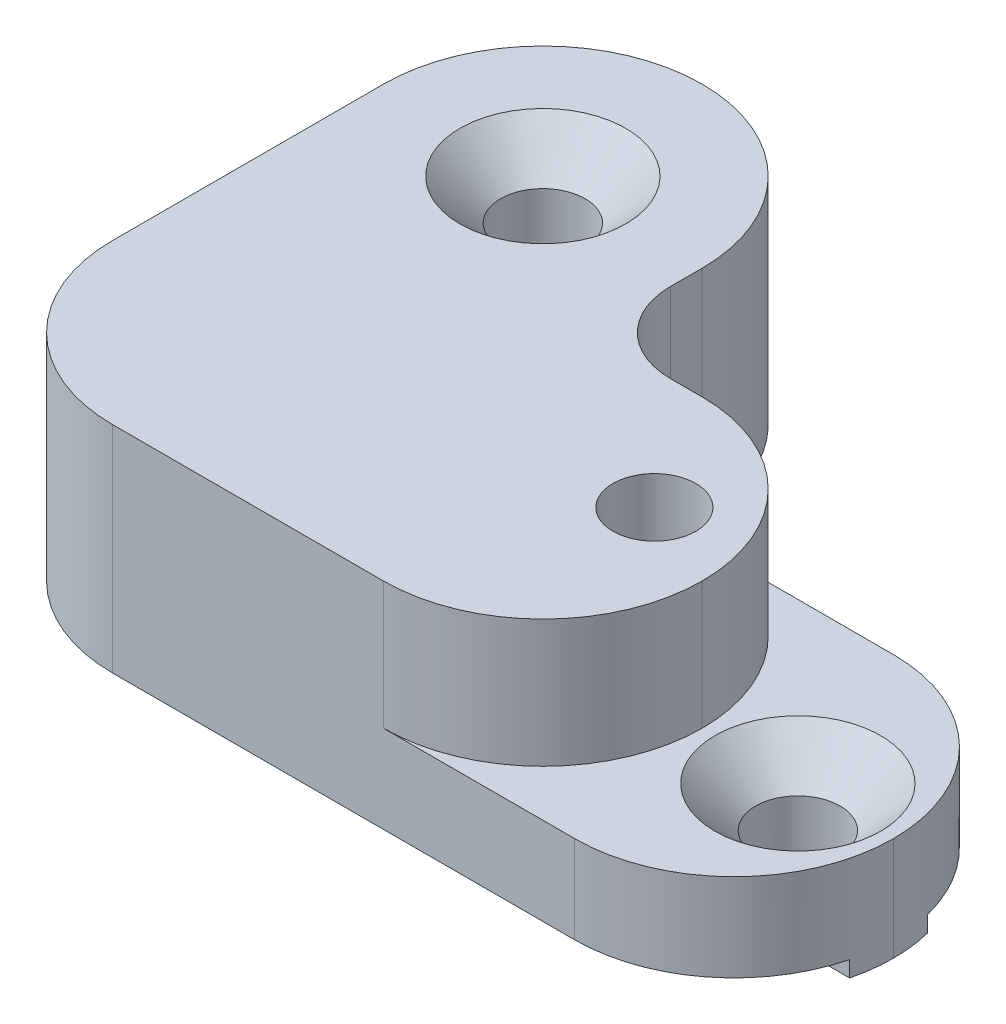
ISO-10303-21;
HEADER;
FILE_DESCRIPTION(('STEP AP214'),'2;1');
FILE_NAME('part.step','',(''),(''),'','','');
FILE_SCHEMA(('AUTOMOTIVE_DESIGN { 1 0 10303 214 1 1 1 1 }'));
ENDSEC;
DATA;
#1=APPLICATION_CONTEXT('core data for automotive mechanical design processes');
#2=APPLICATION_PROTOCOL_DEFINITION('international standard','automotive_design',2000,#1);
#3=PRODUCT_CONTEXT('',#1,'mechanical');
#4=PRODUCT('Part','Part','',(#3));
#5=PRODUCT_RELATED_PRODUCT_CATEGORY('part','',(#4));
#6=PRODUCT_DEFINITION_FORMATION('','',#4);
#7=PRODUCT_DEFINITION_CONTEXT('part definition',#1,'design');
#8=PRODUCT_DEFINITION('design','',#6,#7);
#9=PRODUCT_DEFINITION_SHAPE('','',#8);
#10=(LENGTH_UNIT() NAMED_UNIT(*) SI_UNIT(.MILLI.,.METRE.));
#11=(NAMED_UNIT(*) PLANE_ANGLE_UNIT() SI_UNIT($,.RADIAN.));
#12=(NAMED_UNIT(*) SI_UNIT($,.STERADIAN.) SOLID_ANGLE_UNIT());
#13=UNCERTAINTY_MEASURE_WITH_UNIT(LENGTH_MEASURE(1.E-05),#10,'distance_accuracy_value','');
#14=(GEOMETRIC_REPRESENTATION_CONTEXT(3) GLOBAL_UNCERTAINTY_ASSIGNED_CONTEXT((#13)) GLOBAL_UNIT_ASSIGNED_CONTEXT((#10,
#11,#12)) REPRESENTATION_CONTEXT('',''));
#15=CARTESIAN_POINT('',(0.,0.,0.));
#16=DIRECTION('',(0.,0.,1.));
#17=DIRECTION('',(1.,0.,0.));
#18=AXIS2_PLACEMENT_3D('',#15,#16,#17);
#19=CARTESIAN_POINT('',(0.,-14.5,-2.45));
#20=DIRECTION('',(0.,0.,1.));
#21=DIRECTION('',(1.,0.,0.));
#22=AXIS2_PLACEMENT_3D('',#19,#20,#21);
#23=PLANE('',#22);
#24=DIRECTION('',(1.,0.,0.));
#25=VECTOR('',#24,1.);
#26=CARTESIAN_POINT('',(0.,-13.5,-2.45));
#27=LINE('',#26,#25);
#28=CARTESIAN_POINT('',(34.0099504938362,-13.5,-2.45000000000001));
#29=VERTEX_POINT('',#28);
#30=CARTESIAN_POINT('',(38.6952307863197,-13.5,-2.45000000000001));
#31=VERTEX_POINT('',#30);
#32=EDGE_CURVE('E286',#29,#31,#27,.T.);
#33=ORIENTED_EDGE('',*,*,#32,.T.);
#34=DIRECTION('',(0.,1.,0.));
#35=VECTOR('',#34,1.);
#36=CARTESIAN_POINT('',(38.6952307863197,-13.5,-2.45000000000001));
#37=LINE('',#36,#35);
#38=CARTESIAN_POINT('',(38.6952307863197,-14.5,-2.45000000000001));
#39=VERTEX_POINT('',#38);
#40=EDGE_CURVE('E360',#31,#39,#37,.F.);
#41=ORIENTED_EDGE('',*,*,#40,.T.);
#42=DIRECTION('',(1.,0.,0.));
#43=VECTOR('',#42,1.);
#44=CARTESIAN_POINT('',(0.,-14.5,-2.45));
#45=LINE('',#44,#43);
#46=CARTESIAN_POINT('',(34.0099504938362,-14.5,-2.45000000000001));
#47=VERTEX_POINT('',#46);
#48=EDGE_CURVE('E269',#47,#39,#45,.T.);
#49=ORIENTED_EDGE('',*,*,#48,.F.);
#50=DIRECTION('',(0.,1.,0.));
#51=VECTOR('',#50,1.);
#52=CARTESIAN_POINT('',(34.0099504938362,-8.,-2.45000000000001));
#53=LINE('',#52,#51);
#54=EDGE_CURVE('E242',#47,#29,#53,.T.);
#55=ORIENTED_EDGE('',*,*,#54,.T.);
#56=EDGE_LOOP('',(#33,#41,#49,#55));
#57=FACE_BOUND('',#56,.T.);
#58=ADVANCED_FACE('F45',(#57),#23,.F.);
#59=CARTESIAN_POINT('',(0.,-14.5,2.45));
#60=DIRECTION('',(0.,0.,1.));
#61=DIRECTION('',(1.,0.,0.));
#62=AXIS2_PLACEMENT_3D('',#59,#60,#61);
#63=PLANE('',#62);
#64=DIRECTION('',(1.,0.,0.));
#65=VECTOR('',#64,1.);
#66=CARTESIAN_POINT('',(0.,-14.5,2.45));
#67=LINE('',#66,#65);
#68=CARTESIAN_POINT('',(34.0099504938362,-14.5,2.45000000000001));
#69=VERTEX_POINT('',#68);
#70=CARTESIAN_POINT('',(38.6952307863197,-14.5,2.45));
#71=VERTEX_POINT('',#70);
#72=EDGE_CURVE('E255',#69,#71,#67,.T.);
#73=ORIENTED_EDGE('',*,*,#72,.T.);
#74=DIRECTION('',(0.,-1.,0.));
#75=VECTOR('',#74,1.);
#76=CARTESIAN_POINT('',(38.6952307863197,-14.5,2.45));
#77=LINE('',#76,#75);
#78=CARTESIAN_POINT('',(38.6952307863197,-13.5,2.45));
#79=VERTEX_POINT('',#78);
#80=EDGE_CURVE('E371',#71,#79,#77,.F.);
#81=ORIENTED_EDGE('',*,*,#80,.T.);
#82=DIRECTION('',(1.,0.,0.));
#83=VECTOR('',#82,1.);
#84=CARTESIAN_POINT('',(0.,-13.5,2.45));
#85=LINE('',#84,#83);
#86=CARTESIAN_POINT('',(34.0099504938362,-13.5,2.45));
#87=VERTEX_POINT('',#86);
#88=EDGE_CURVE('E258',#87,#79,#85,.T.);
#89=ORIENTED_EDGE('',*,*,#88,.F.);
#90=DIRECTION('',(0.,1.,0.));
#91=VECTOR('',#90,1.);
#92=CARTESIAN_POINT('',(34.0099504938362,-8.,2.45));
#93=LINE('',#92,#91);
#94=EDGE_CURVE('E239',#69,#87,#93,.T.);
#95=ORIENTED_EDGE('',*,*,#94,.F.);
#96=EDGE_LOOP('',(#73,#81,#89,#95));
#97=FACE_BOUND('',#96,.T.);
#98=ADVANCED_FACE('F254',(#97),#63,.T.);
#99=CARTESIAN_POINT('',(0.,-14.5,0.));
#100=DIRECTION('',(0.,1.,0.));
#101=DIRECTION('',(0.,0.,1.));
#102=AXIS2_PLACEMENT_3D('',#99,#100,#101);
#103=PLANE('',#102);
#104=ORIENTED_EDGE('',*,*,#48,.T.);
#105=CARTESIAN_POINT('',(29.,-14.5,0.));
#106=DIRECTION('',(0.,1.,0.));
#107=DIRECTION('',(0.,0.,1.));
#108=AXIS2_PLACEMENT_3D('',#105,#106,#107);
#109=CIRCLE('',#108,10.);
#110=CARTESIAN_POINT('',(39.,-14.5,0.));
#111=VERTEX_POINT('',#110);
#112=EDGE_CURVE('E363',#39,#111,#109,.F.);
#113=ORIENTED_EDGE('',*,*,#112,.T.);
#114=CARTESIAN_POINT('',(29.,-14.5,0.));
#115=DIRECTION('',(0.,1.,0.));
#116=DIRECTION('',(0.,0.,1.));
#117=AXIS2_PLACEMENT_3D('',#114,#115,#116);
#118=CIRCLE('',#117,10.);
#119=EDGE_CURVE('E264',#111,#71,#118,.F.);
#120=ORIENTED_EDGE('',*,*,#119,.T.);
#121=ORIENTED_EDGE('',*,*,#72,.F.);
#122=CARTESIAN_POINT('',(33.,-14.5,0.));
#123=DIRECTION('',(0.,1.,0.));
#124=DIRECTION('',(0.,0.,1.));
#125=AXIS2_PLACEMENT_3D('',#122,#123,#124);
#126=CIRCLE('',#125,2.65);
#127=EDGE_CURVE('E236',#69,#47,#126,.T.);
#128=ORIENTED_EDGE('',*,*,#127,.T.);
#129=EDGE_LOOP('',(#104,#113,#120,#121,#128));
#130=FACE_BOUND('',#129,.T.);
#131=ADVANCED_FACE('F262',(#130),#103,.F.);
#132=CARTESIAN_POINT('',(0.,-13.5,0.));
#133=DIRECTION('',(0.,1.,0.));
#134=DIRECTION('',(0.,0.,1.));
#135=AXIS2_PLACEMENT_3D('',#132,#133,#134);
#136=PLANE('',#135);
#137=CARTESIAN_POINT('',(2.5,-13.5,-2.50000000000001));
#138=DIRECTION('',(0.,1.,0.));
#139=DIRECTION('',(0.,0.,1.));
#140=AXIS2_PLACEMENT_3D('',#137,#138,#139);
#141=CIRCLE('',#140,6.25);
#142=CARTESIAN_POINT('',(2.5,-13.5,3.74999999999999));
#143=VERTEX_POINT('',#142);
#144=EDGE_CURVE('E301',#143,#143,#141,.T.);
#145=ORIENTED_EDGE('',*,*,#144,.T.);
#146=EDGE_LOOP('',(#145));
#147=FACE_BOUND('',#146,.T.);
#148=DIRECTION('',(0.,0.,-1.));
#149=VECTOR('',#148,1.);
#150=CARTESIAN_POINT('',(-10.,-13.5,0.));
#151=LINE('',#150,#149);
#152=CARTESIAN_POINT('',(-10.,-13.5,0.));
#153=VERTEX_POINT('',#152);
#154=CARTESIAN_POINT('',(-10.0000000000001,-13.5,-17.));
#155=VERTEX_POINT('',#154);
#156=EDGE_CURVE('E505',#153,#155,#151,.T.);
#157=ORIENTED_EDGE('',*,*,#156,.T.);
#158=CARTESIAN_POINT('',(0.,-13.5,-17.));
#159=DIRECTION('',(0.,1.,0.));
#160=DIRECTION('',(0.,0.,1.));
#161=AXIS2_PLACEMENT_3D('',#158,#159,#160);
#162=CIRCLE('',#161,10.);
#163=CARTESIAN_POINT('',(-2.4500000000001,-13.5,-26.6952307863197));
#164=VERTEX_POINT('',#163);
#165=EDGE_CURVE('E337',#155,#164,#162,.F.);
#166=ORIENTED_EDGE('',*,*,#165,.T.);
#167=DIRECTION('',(0.,0.,-1.));
#168=VECTOR('',#167,1.);
#169=CARTESIAN_POINT('',(-2.45,-13.5,0.));
#170=LINE('',#169,#168);
#171=CARTESIAN_POINT('',(-2.45000000000006,-13.5,-18.0099504938362));
#172=VERTEX_POINT('',#171);
#173=EDGE_CURVE('E478',#172,#164,#170,.T.);
#174=ORIENTED_EDGE('',*,*,#173,.F.);
#175=CARTESIAN_POINT('',(0.,-13.5,-17.));
#176=DIRECTION('',(0.,1.,0.));
#177=DIRECTION('',(0.,0.,1.));
#178=AXIS2_PLACEMENT_3D('',#175,#176,#177);
#179=CIRCLE('',#178,2.64999999999999);
#180=CARTESIAN_POINT('',(-2.45000000000006,-13.5,-15.9900495061638));
#181=VERTEX_POINT('',#180);
#182=EDGE_CURVE('E471',#172,#181,#179,.T.);
#183=ORIENTED_EDGE('',*,*,#182,.T.);
#184=CARTESIAN_POINT('',(-2.45000000000004,-13.5,-10.5));
#185=VERTEX_POINT('',#184);
#186=EDGE_CURVE('E491',#185,#181,#170,.T.);
#187=ORIENTED_EDGE('',*,*,#186,.F.);
#188=DIRECTION('',(1.,0.,0.));
#189=VECTOR('',#188,1.);
#190=CARTESIAN_POINT('',(0.,-13.5,-10.5));
#191=LINE('',#190,#189);
#192=CARTESIAN_POINT('',(2.44999999999996,-13.5,-10.5));
#193=VERTEX_POINT('',#192);
#194=EDGE_CURVE('E498',#185,#193,#191,.T.);
#195=ORIENTED_EDGE('',*,*,#194,.T.);
#196=DIRECTION('',(0.,0.,-1.));
#197=VECTOR('',#196,1.);
#198=CARTESIAN_POINT('',(2.45,-13.5,0.));
#199=LINE('',#198,#197);
#200=CARTESIAN_POINT('',(2.44999999999994,-13.5,-15.9900495061639));
#201=VERTEX_POINT('',#200);
#202=EDGE_CURVE('E495',#193,#201,#199,.T.);
#203=ORIENTED_EDGE('',*,*,#202,.T.);
#204=CARTESIAN_POINT('',(2.44999999999994,-13.5,-18.0099504938362));
#205=VERTEX_POINT('',#204);
#206=EDGE_CURVE('E467',#201,#205,#179,.T.);
#207=ORIENTED_EDGE('',*,*,#206,.T.);
#208=CARTESIAN_POINT('',(2.44999999999991,-13.5,-26.6952307863197));
#209=VERTEX_POINT('',#208);
#210=EDGE_CURVE('E494',#205,#209,#199,.T.);
#211=ORIENTED_EDGE('',*,*,#210,.T.);
#212=CARTESIAN_POINT('',(0.,-13.5,-17.));
#213=DIRECTION('',(0.,1.,0.));
#214=DIRECTION('',(0.,0.,1.));
#215=AXIS2_PLACEMENT_3D('',#212,#213,#214);
#216=CIRCLE('',#215,10.);
#217=CARTESIAN_POINT('',(9.99999999999994,-13.5,-17.0000000000001));
#218=VERTEX_POINT('',#217);
#219=EDGE_CURVE('E334',#209,#218,#216,.F.);
#220=ORIENTED_EDGE('',*,*,#219,.T.);
#221=DIRECTION('',(0.,0.,-1.));
#222=VECTOR('',#221,1.);
#223=CARTESIAN_POINT('',(10.,-13.5,0.));
#224=LINE('',#223,#222);
#225=CARTESIAN_POINT('',(9.99999999999995,-13.5,-15.));
#226=VERTEX_POINT('',#225);
#227=EDGE_CURVE('E507',#226,#218,#224,.T.);
#228=ORIENTED_EDGE('',*,*,#227,.F.);
#229=CARTESIAN_POINT('',(15.,-13.5,-15.));
#230=DIRECTION('',(0.,1.,0.));
#231=DIRECTION('',(0.,0.,1.));
#232=AXIS2_PLACEMENT_3D('',#229,#230,#231);
#233=CIRCLE('',#232,5.);
#234=CARTESIAN_POINT('',(15.,-13.5,-10.));
#235=VERTEX_POINT('',#234);
#236=EDGE_CURVE('E394',#226,#235,#233,.T.);
#237=ORIENTED_EDGE('',*,*,#236,.T.);
#238=DIRECTION('',(1.,0.,0.));
#239=VECTOR('',#238,1.);
#240=CARTESIAN_POINT('',(0.,-13.5,-10.));
#241=LINE('',#240,#239);
#242=CARTESIAN_POINT('',(29.,-13.5,-10.));
#243=VERTEX_POINT('',#242);
#244=EDGE_CURVE('E298',#235,#243,#241,.T.);
#245=ORIENTED_EDGE('',*,*,#244,.T.);
#246=CARTESIAN_POINT('',(29.,-13.5,0.));
#247=DIRECTION('',(0.,1.,0.));
#248=DIRECTION('',(0.,0.,1.));
#249=AXIS2_PLACEMENT_3D('',#246,#247,#248);
#250=CIRCLE('',#249,10.);
#251=EDGE_CURVE('E332',#243,#31,#250,.F.);
#252=ORIENTED_EDGE('',*,*,#251,.T.);
#253=ORIENTED_EDGE('',*,*,#32,.F.);
#254=CARTESIAN_POINT('',(33.,-13.5,0.));
#255=DIRECTION('',(0.,1.,0.));
#256=DIRECTION('',(0.,0.,1.));
#257=AXIS2_PLACEMENT_3D('',#254,#255,#256);
#258=CIRCLE('',#257,2.64999999999999);
#259=CARTESIAN_POINT('',(31.9900495061639,-13.5,-2.45000000000001));
#260=VERTEX_POINT('',#259);
#261=EDGE_CURVE('E442',#29,#260,#258,.T.);
#262=ORIENTED_EDGE('',*,*,#261,.T.);
#263=CARTESIAN_POINT('',(10.5,-13.5,-2.45));
#264=VERTEX_POINT('',#263);
#265=EDGE_CURVE('E271',#264,#260,#27,.T.);
#266=ORIENTED_EDGE('',*,*,#265,.F.);
#267=DIRECTION('',(0.,0.,-1.));
#268=VECTOR('',#267,1.);
#269=CARTESIAN_POINT('',(10.5,-13.5,0.));
#270=LINE('',#269,#268);
#271=CARTESIAN_POINT('',(10.5,-13.5,2.45));
#272=VERTEX_POINT('',#271);
#273=EDGE_CURVE('E266',#272,#264,#270,.T.);
#274=ORIENTED_EDGE('',*,*,#273,.F.);
#275=CARTESIAN_POINT('',(31.9900495061638,-13.5,2.45));
#276=VERTEX_POINT('',#275);
#277=EDGE_CURVE('E283',#272,#276,#85,.T.);
#278=ORIENTED_EDGE('',*,*,#277,.T.);
#279=EDGE_CURVE('E247',#276,#87,#258,.T.);
#280=ORIENTED_EDGE('',*,*,#279,.T.);
#281=ORIENTED_EDGE('',*,*,#88,.T.);
#282=CARTESIAN_POINT('',(29.,-13.5,0.));
#283=DIRECTION('',(0.,1.,0.));
#284=DIRECTION('',(0.,0.,1.));
#285=AXIS2_PLACEMENT_3D('',#282,#283,#284);
#286=CIRCLE('',#285,10.);
#287=CARTESIAN_POINT('',(29.,-13.5,10.));
#288=VERTEX_POINT('',#287);
#289=EDGE_CURVE('E330',#79,#288,#286,.F.);
#290=ORIENTED_EDGE('',*,*,#289,.T.);
#291=DIRECTION('',(1.,0.,0.));
#292=VECTOR('',#291,1.);
#293=CARTESIAN_POINT('',(0.,-13.5,10.));
#294=LINE('',#293,#292);
#295=CARTESIAN_POINT('',(0.,-13.5,10.));
#296=VERTEX_POINT('',#295);
#297=EDGE_CURVE('E295',#296,#288,#294,.T.);
#298=ORIENTED_EDGE('',*,*,#297,.F.);
#299=CARTESIAN_POINT('',(0.,-13.5,0.));
#300=DIRECTION('',(0.,1.,0.));
#301=DIRECTION('',(0.,0.,1.));
#302=AXIS2_PLACEMENT_3D('',#299,#300,#301);
#303=CIRCLE('',#302,10.);
#304=EDGE_CURVE('E328',#296,#153,#303,.F.);
#305=ORIENTED_EDGE('',*,*,#304,.T.);
#306=EDGE_LOOP('',(#157,#166,#174,#183,#187,#195,#203,#207,#211,#220,#228,#237,#245,#252,#253,
#262,#266,#274,#278,#280,#281,#290,#298,#305));
#307=FACE_BOUND('',#306,.T.);
#308=ADVANCED_FACE('F440',(#147,#307),#136,.F.);
#309=CARTESIAN_POINT('',(-2.45,-14.5,0.));
#310=DIRECTION('',(-1.,0.,0.));
#311=DIRECTION('',(0.,0.,-1.));
#312=AXIS2_PLACEMENT_3D('',#309,#310,#311);
#313=PLANE('',#312);
#314=DIRECTION('',(0.,1.,0.));
#315=VECTOR('',#314,1.);
#316=CARTESIAN_POINT('',(-2.45000000000005,0.,-15.9900495061638));
#317=LINE('',#316,#315);
#318=CARTESIAN_POINT('',(-2.45000000000006,-14.5,-15.9900495061638));
#319=VERTEX_POINT('',#318);
#320=EDGE_CURVE('E476',#319,#181,#317,.T.);
#321=ORIENTED_EDGE('',*,*,#320,.F.);
#322=DIRECTION('',(0.,0.,-1.));
#323=VECTOR('',#322,1.);
#324=CARTESIAN_POINT('',(-2.45,-14.5,0.));
#325=LINE('',#324,#323);
#326=CARTESIAN_POINT('',(-2.45000000000004,-14.5,-10.5));
#327=VERTEX_POINT('',#326);
#328=EDGE_CURVE('E479',#327,#319,#325,.T.);
#329=ORIENTED_EDGE('',*,*,#328,.F.);
#330=DIRECTION('',(0.,1.,0.));
#331=VECTOR('',#330,1.);
#332=CARTESIAN_POINT('',(-2.45000000000004,-14.5,-10.5));
#333=LINE('',#332,#331);
#334=EDGE_CURVE('E501',#327,#185,#333,.T.);
#335=ORIENTED_EDGE('',*,*,#334,.T.);
#336=ORIENTED_EDGE('',*,*,#186,.T.);
#337=EDGE_LOOP('',(#321,#329,#335,#336));
#338=FACE_BOUND('',#337,.T.);
#339=ADVANCED_FACE('F647',(#338),#313,.T.);
#340=CARTESIAN_POINT('',(2.45,-14.5,0.));
#341=DIRECTION('',(-1.,0.,0.));
#342=DIRECTION('',(0.,0.,-1.));
#343=AXIS2_PLACEMENT_3D('',#340,#341,#342);
#344=PLANE('',#343);
#345=DIRECTION('',(0.,0.,-1.));
#346=VECTOR('',#345,1.);
#347=CARTESIAN_POINT('',(2.45,-14.5,0.));
#348=LINE('',#347,#346);
#349=CARTESIAN_POINT('',(2.44999999999996,-14.5,-10.5));
#350=VERTEX_POINT('',#349);
#351=CARTESIAN_POINT('',(2.44999999999994,-14.5,-15.9900495061639));
#352=VERTEX_POINT('',#351);
#353=EDGE_CURVE('E484',#350,#352,#348,.T.);
#354=ORIENTED_EDGE('',*,*,#353,.T.);
#355=DIRECTION('',(0.,1.,0.));
#356=VECTOR('',#355,1.);
#357=CARTESIAN_POINT('',(2.44999999999995,0.,-15.9900495061639));
#358=LINE('',#357,#356);
#359=EDGE_CURVE('E470',#352,#201,#358,.T.);
#360=ORIENTED_EDGE('',*,*,#359,.T.);
#361=ORIENTED_EDGE('',*,*,#202,.F.);
#362=DIRECTION('',(0.,1.,0.));
#363=VECTOR('',#362,1.);
#364=CARTESIAN_POINT('',(2.44999999999996,-14.5,-10.5));
#365=LINE('',#364,#363);
#366=EDGE_CURVE('E490',#350,#193,#365,.T.);
#367=ORIENTED_EDGE('',*,*,#366,.F.);
#368=EDGE_LOOP('',(#354,#360,#361,#367));
#369=FACE_BOUND('',#368,.T.);
#370=ADVANCED_FACE('F644',(#369),#344,.F.);
#371=CARTESIAN_POINT('',(0.,-14.5,0.));
#372=DIRECTION('',(0.,1.,0.));
#373=DIRECTION('',(-1.,0.,0.));
#374=AXIS2_PLACEMENT_3D('',#371,#372,#373);
#375=PLANE('',#374);
#376=CARTESIAN_POINT('',(-2.45000000000007,-14.5,-18.0099504938362));
#377=VERTEX_POINT('',#376);
#378=CARTESIAN_POINT('',(-2.4500000000001,-14.5,-26.6952307863197));
#379=VERTEX_POINT('',#378);
#380=EDGE_CURVE('E483',#377,#379,#325,.T.);
#381=ORIENTED_EDGE('',*,*,#380,.T.);
#382=CARTESIAN_POINT('',(0.,-14.5,-17.));
#383=DIRECTION('',(0.,1.,0.));
#384=DIRECTION('',(0.,0.,1.));
#385=AXIS2_PLACEMENT_3D('',#382,#383,#384);
#386=CIRCLE('',#385,10.);
#387=CARTESIAN_POINT('',(0.,-14.5,-27.));
#388=VERTEX_POINT('',#387);
#389=EDGE_CURVE('E343',#379,#388,#386,.F.);
#390=ORIENTED_EDGE('',*,*,#389,.T.);
#391=CARTESIAN_POINT('',(0.,-14.5,-17.));
#392=DIRECTION('',(0.,1.,0.));
#393=DIRECTION('',(0.,0.,1.));
#394=AXIS2_PLACEMENT_3D('',#391,#392,#393);
#395=CIRCLE('',#394,10.);
#396=CARTESIAN_POINT('',(2.44999999999991,-14.5,-26.6952307863197));
#397=VERTEX_POINT('',#396);
#398=EDGE_CURVE('E341',#388,#397,#395,.F.);
#399=ORIENTED_EDGE('',*,*,#398,.T.);
#400=CARTESIAN_POINT('',(2.44999999999994,-14.5,-18.0099504938362));
#401=VERTEX_POINT('',#400);
#402=EDGE_CURVE('E482',#401,#397,#348,.T.);
#403=ORIENTED_EDGE('',*,*,#402,.F.);
#404=CARTESIAN_POINT('',(0.,-14.5,-17.));
#405=DIRECTION('',(0.,1.,0.));
#406=DIRECTION('',(0.,0.,1.));
#407=AXIS2_PLACEMENT_3D('',#404,#405,#406);
#408=CIRCLE('',#407,2.64999999999999);
#409=EDGE_CURVE('E310',#401,#377,#408,.T.);
#410=ORIENTED_EDGE('',*,*,#409,.T.);
#411=EDGE_LOOP('',(#381,#390,#399,#403,#410));
#412=FACE_BOUND('',#411,.T.);
#413=ADVANCED_FACE('F569',(#412),#375,.F.);
#414=CARTESIAN_POINT('',(2.5,-13.5,-2.50000000000001));
#415=DIRECTION('',(0.,1.,0.));
#416=DIRECTION('',(0.,0.,1.));
#417=AXIS2_PLACEMENT_3D('',#414,#415,#416);
#418=CYLINDRICAL_SURFACE('',#417,6.25);
#419=CARTESIAN_POINT('',(2.5,-0.6,-2.50000000000001));
#420=DIRECTION('',(0.,1.,0.));
#421=DIRECTION('',(0.,0.,1.));
#422=AXIS2_PLACEMENT_3D('',#419,#420,#421);
#423=CIRCLE('',#422,6.25);
#424=CARTESIAN_POINT('',(2.5,-0.6,3.74999999999999));
#425=VERTEX_POINT('',#424);
#426=EDGE_CURVE('E275',#425,#425,#423,.T.);
#427=ORIENTED_EDGE('',*,*,#426,.T.);
#428=EDGE_LOOP('',(#427));
#429=FACE_BOUND('',#428,.T.);
#430=ORIENTED_EDGE('',*,*,#144,.F.);
#431=EDGE_LOOP('',(#430));
#432=FACE_BOUND('',#431,.T.);
#433=ADVANCED_FACE('F659',(#429,#432),#418,.F.);
#434=CARTESIAN_POINT('',(0.,-13.5,10.));
#435=DIRECTION('',(0.,0.,1.));
#436=DIRECTION('',(1.,0.,0.));
#437=AXIS2_PLACEMENT_3D('',#434,#435,#436);
#438=PLANE('',#437);
#439=ORIENTED_EDGE('',*,*,#297,.T.);
#440=DIRECTION('',(0.,1.,0.));
#441=VECTOR('',#440,1.);
#442=CARTESIAN_POINT('',(29.,-8.,10.));
#443=LINE('',#442,#441);
#444=CARTESIAN_POINT('',(29.,-8.,10.));
#445=VERTEX_POINT('',#444);
#446=EDGE_CURVE('E369',#288,#445,#443,.T.);
#447=ORIENTED_EDGE('',*,*,#446,.T.);
#448=DIRECTION('',(-1.,0.,0.));
#449=VECTOR('',#448,1.);
#450=CARTESIAN_POINT('',(0.,-8.,10.));
#451=LINE('',#450,#449);
#452=CARTESIAN_POINT('',(17.,-8.,10.));
#453=VERTEX_POINT('',#452);
#454=EDGE_CURVE('E451',#445,#453,#451,.T.);
#455=ORIENTED_EDGE('',*,*,#454,.T.);
#456=DIRECTION('',(0.,1.,0.));
#457=VECTOR('',#456,1.);
#458=CARTESIAN_POINT('',(17.,-13.5,10.));
#459=LINE('',#458,#457);
#460=CARTESIAN_POINT('',(17.,0.,10.));
#461=VERTEX_POINT('',#460);
#462=EDGE_CURVE('E367',#453,#461,#459,.T.);
#463=ORIENTED_EDGE('',*,*,#462,.T.);
#464=DIRECTION('',(1.,0.,0.));
#465=VECTOR('',#464,1.);
#466=CARTESIAN_POINT('',(0.,0.,10.));
#467=LINE('',#466,#465);
#468=CARTESIAN_POINT('',(0.,0.,10.));
#469=VERTEX_POINT('',#468);
#470=EDGE_CURVE('E292',#469,#461,#467,.T.);
#471=ORIENTED_EDGE('',*,*,#470,.F.);
#472=DIRECTION('',(0.,1.,0.));
#473=VECTOR('',#472,1.);
#474=CARTESIAN_POINT('',(0.,-13.5,10.));
#475=LINE('',#474,#473);
#476=EDGE_CURVE('E365',#469,#296,#475,.F.);
#477=ORIENTED_EDGE('',*,*,#476,.T.);
#478=EDGE_LOOP('',(#439,#447,#455,#463,#471,#477));
#479=FACE_BOUND('',#478,.T.);
#480=ADVANCED_FACE('F538',(#479),#438,.T.);
#481=CARTESIAN_POINT('',(0.,-13.5,-10.));
#482=DIRECTION('',(0.,0.,1.));
#483=DIRECTION('',(1.,0.,0.));
#484=AXIS2_PLACEMENT_3D('',#481,#482,#483);
#485=PLANE('',#484);
#486=ORIENTED_EDGE('',*,*,#244,.F.);
#487=DIRECTION('',(0.,1.,0.));
#488=VECTOR('',#487,1.);
#489=CARTESIAN_POINT('',(15.,0.,-10.));
#490=LINE('',#489,#488);
#491=CARTESIAN_POINT('',(15.,0.,-10.));
#492=VERTEX_POINT('',#491);
#493=EDGE_CURVE('E378',#235,#492,#490,.T.);
#494=ORIENTED_EDGE('',*,*,#493,.T.);
#495=DIRECTION('',(1.,0.,0.));
#496=VECTOR('',#495,1.);
#497=CARTESIAN_POINT('',(0.,0.,-10.));
#498=LINE('',#497,#496);
#499=CARTESIAN_POINT('',(17.,0.,-10.));
#500=VERTEX_POINT('',#499);
#501=EDGE_CURVE('E299',#492,#500,#498,.T.);
#502=ORIENTED_EDGE('',*,*,#501,.T.);
#503=DIRECTION('',(0.,1.,0.));
#504=VECTOR('',#503,1.);
#505=CARTESIAN_POINT('',(17.,-8.,-10.));
#506=LINE('',#505,#504);
#507=CARTESIAN_POINT('',(17.,-8.,-10.));
#508=VERTEX_POINT('',#507);
#509=EDGE_CURVE('E354',#500,#508,#506,.F.);
#510=ORIENTED_EDGE('',*,*,#509,.T.);
#511=DIRECTION('',(1.,0.,0.));
#512=VECTOR('',#511,1.);
#513=CARTESIAN_POINT('',(0.,-8.,-10.));
#514=LINE('',#513,#512);
#515=CARTESIAN_POINT('',(29.,-8.,-10.));
#516=VERTEX_POINT('',#515);
#517=EDGE_CURVE('E453',#508,#516,#514,.T.);
#518=ORIENTED_EDGE('',*,*,#517,.T.);
#519=DIRECTION('',(0.,1.,0.));
#520=VECTOR('',#519,1.);
#521=CARTESIAN_POINT('',(29.,-13.5,-10.));
#522=LINE('',#521,#520);
#523=EDGE_CURVE('E357',#516,#243,#522,.F.);
#524=ORIENTED_EDGE('',*,*,#523,.T.);
#525=EDGE_LOOP('',(#486,#494,#502,#510,#518,#524));
#526=FACE_BOUND('',#525,.T.);
#527=ADVANCED_FACE('F553',(#526),#485,.F.);
#528=CARTESIAN_POINT('',(0.,0.,0.));
#529=DIRECTION('',(0.,1.,0.));
#530=DIRECTION('',(0.,0.,1.));
#531=AXIS2_PLACEMENT_3D('',#528,#529,#530);
#532=PLANE('',#531);
#533=CARTESIAN_POINT('',(21.5,0.,-2.50000000000001));
#534=DIRECTION('',(0.,1.,0.));
#535=DIRECTION('',(0.,0.,1.));
#536=AXIS2_PLACEMENT_3D('',#533,#534,#535);
#537=CIRCLE('',#536,2.6);
#538=CARTESIAN_POINT('',(21.5,0.,0.0999999999999903));
#539=VERTEX_POINT('',#538);
#540=EDGE_CURVE('E389',#539,#539,#537,.T.);
#541=ORIENTED_EDGE('',*,*,#540,.F.);
#542=EDGE_LOOP('',(#541));
#543=FACE_BOUND('',#542,.T.);
#544=CARTESIAN_POINT('',(0.,0.,-17.));
#545=DIRECTION('',(0.,1.,0.));
#546=DIRECTION('',(0.,0.,1.));
#547=AXIS2_PLACEMENT_3D('',#544,#545,#546);
#548=CIRCLE('',#547,5.2);
#549=CARTESIAN_POINT('',(0.,0.,-11.8));
#550=VERTEX_POINT('',#549);
#551=EDGE_CURVE('E458',#550,#550,#548,.T.);
#552=ORIENTED_EDGE('',*,*,#551,.F.);
#553=EDGE_LOOP('',(#552));
#554=FACE_BOUND('',#553,.T.);
#555=CARTESIAN_POINT('',(0.,0.,-17.));
#556=DIRECTION('',(0.,1.,0.));
#557=DIRECTION('',(0.,0.,1.));
#558=AXIS2_PLACEMENT_3D('',#555,#556,#557);
#559=CIRCLE('',#558,10.);
#560=CARTESIAN_POINT('',(9.99999999999994,0.,-17.0000000000001));
#561=VERTEX_POINT('',#560);
#562=CARTESIAN_POINT('',(0.,0.,-27.));
#563=VERTEX_POINT('',#562);
#564=EDGE_CURVE('E318',#561,#563,#559,.T.);
#565=ORIENTED_EDGE('',*,*,#564,.T.);
#566=CARTESIAN_POINT('',(0.,0.,-17.));
#567=DIRECTION('',(0.,1.,0.));
#568=DIRECTION('',(0.,0.,1.));
#569=AXIS2_PLACEMENT_3D('',#566,#567,#568);
#570=CIRCLE('',#569,10.);
#571=CARTESIAN_POINT('',(-10.0000000000001,0.,-17.));
#572=VERTEX_POINT('',#571);
#573=EDGE_CURVE('E320',#563,#572,#570,.T.);
#574=ORIENTED_EDGE('',*,*,#573,.T.);
#575=DIRECTION('',(0.,0.,-1.));
#576=VECTOR('',#575,1.);
#577=CARTESIAN_POINT('',(-10.,0.,0.));
#578=LINE('',#577,#576);
#579=CARTESIAN_POINT('',(-10.,0.,0.));
#580=VERTEX_POINT('',#579);
#581=EDGE_CURVE('E503',#580,#572,#578,.T.);
#582=ORIENTED_EDGE('',*,*,#581,.F.);
#583=CARTESIAN_POINT('',(0.,0.,0.));
#584=DIRECTION('',(0.,1.,0.));
#585=DIRECTION('',(0.,0.,1.));
#586=AXIS2_PLACEMENT_3D('',#583,#584,#585);
#587=CIRCLE('',#586,10.);
#588=EDGE_CURVE('E259',#580,#469,#587,.T.);
#589=ORIENTED_EDGE('',*,*,#588,.T.);
#590=ORIENTED_EDGE('',*,*,#470,.T.);
#591=CARTESIAN_POINT('',(17.,0.,0.));
#592=DIRECTION('',(0.,1.,0.));
#593=DIRECTION('',(0.,0.,1.));
#594=AXIS2_PLACEMENT_3D('',#591,#592,#593);
#595=CIRCLE('',#594,10.);
#596=CARTESIAN_POINT('',(27.,0.,0.));
#597=VERTEX_POINT('',#596);
#598=EDGE_CURVE('E313',#461,#597,#595,.T.);
#599=ORIENTED_EDGE('',*,*,#598,.T.);
#600=CARTESIAN_POINT('',(17.,0.,0.));
#601=DIRECTION('',(0.,1.,0.));
#602=DIRECTION('',(0.,0.,1.));
#603=AXIS2_PLACEMENT_3D('',#600,#601,#602);
#604=CIRCLE('',#603,10.);
#605=EDGE_CURVE('E315',#597,#500,#604,.T.);
#606=ORIENTED_EDGE('',*,*,#605,.T.);
#607=ORIENTED_EDGE('',*,*,#501,.F.);
#608=CARTESIAN_POINT('',(15.,0.,-15.));
#609=DIRECTION('',(0.,1.,0.));
#610=DIRECTION('',(0.,0.,1.));
#611=AXIS2_PLACEMENT_3D('',#608,#609,#610);
#612=CIRCLE('',#611,5.);
#613=CARTESIAN_POINT('',(9.99999999999995,0.,-15.));
#614=VERTEX_POINT('',#613);
#615=EDGE_CURVE('E61',#492,#614,#612,.F.);
#616=ORIENTED_EDGE('',*,*,#615,.T.);
#617=DIRECTION('',(0.,0.,-1.));
#618=VECTOR('',#617,1.);
#619=CARTESIAN_POINT('',(10.,0.,0.));
#620=LINE('',#619,#618);
#621=EDGE_CURVE('E508',#614,#561,#620,.T.);
#622=ORIENTED_EDGE('',*,*,#621,.T.);
#623=EDGE_LOOP('',(#565,#574,#582,#589,#590,#599,#606,#607,#616,#622));
#624=FACE_BOUND('',#623,.T.);
#625=ADVANCED_FACE('F511',(#543,#554,#624),#532,.T.);
#626=DIRECTION('',(0.,1.,0.));
#627=VECTOR('',#626,1.);
#628=CARTESIAN_POINT('',(31.9900495061638,-8.,2.45));
#629=LINE('',#628,#627);
#630=CARTESIAN_POINT('',(31.9900495061638,-14.5,2.45));
#631=VERTEX_POINT('',#630);
#632=EDGE_CURVE('E260',#276,#631,#629,.F.);
#633=ORIENTED_EDGE('',*,*,#632,.F.);
#634=ORIENTED_EDGE('',*,*,#277,.F.);
#635=DIRECTION('',(0.,1.,0.));
#636=VECTOR('',#635,1.);
#637=CARTESIAN_POINT('',(10.5,-14.5,2.45));
#638=LINE('',#637,#636);
#639=CARTESIAN_POINT('',(10.5,-14.5,2.45));
#640=VERTEX_POINT('',#639);
#641=EDGE_CURVE('E289',#640,#272,#638,.T.);
#642=ORIENTED_EDGE('',*,*,#641,.F.);
#643=EDGE_CURVE('E265',#640,#631,#67,.T.);
#644=ORIENTED_EDGE('',*,*,#643,.T.);
#645=EDGE_LOOP('',(#633,#634,#642,#644));
#646=FACE_BOUND('',#645,.T.);
#647=ADVANCED_FACE('F417',(#646),#63,.T.);
#648=CARTESIAN_POINT('',(10.5,-14.5,0.));
#649=DIRECTION('',(1.,0.,0.));
#650=DIRECTION('',(0.,0.,-1.));
#651=AXIS2_PLACEMENT_3D('',#648,#649,#650);
#652=PLANE('',#651);
#653=ORIENTED_EDGE('',*,*,#273,.T.);
#654=DIRECTION('',(0.,1.,0.));
#655=VECTOR('',#654,1.);
#656=CARTESIAN_POINT('',(10.5,-14.5,-2.45));
#657=LINE('',#656,#655);
#658=CARTESIAN_POINT('',(10.5,-14.5,-2.45));
#659=VERTEX_POINT('',#658);
#660=EDGE_CURVE('E282',#659,#264,#657,.T.);
#661=ORIENTED_EDGE('',*,*,#660,.F.);
#662=DIRECTION('',(0.,0.,-1.));
#663=VECTOR('',#662,1.);
#664=CARTESIAN_POINT('',(10.5,-14.5,0.));
#665=LINE('',#664,#663);
#666=EDGE_CURVE('E280',#640,#659,#665,.T.);
#667=ORIENTED_EDGE('',*,*,#666,.F.);
#668=ORIENTED_EDGE('',*,*,#641,.T.);
#669=EDGE_LOOP('',(#653,#661,#667,#668));
#670=FACE_BOUND('',#669,.T.);
#671=ADVANCED_FACE('F422',(#670),#652,.F.);
#672=ORIENTED_EDGE('',*,*,#265,.T.);
#673=DIRECTION('',(0.,1.,0.));
#674=VECTOR('',#673,1.);
#675=CARTESIAN_POINT('',(31.9900495061639,-8.,-2.45000000000001));
#676=LINE('',#675,#674);
#677=CARTESIAN_POINT('',(31.9900495061639,-14.5,-2.45000000000001));
#678=VERTEX_POINT('',#677);
#679=EDGE_CURVE('E435',#260,#678,#676,.F.);
#680=ORIENTED_EDGE('',*,*,#679,.T.);
#681=EDGE_CURVE('E277',#659,#678,#45,.T.);
#682=ORIENTED_EDGE('',*,*,#681,.F.);
#683=ORIENTED_EDGE('',*,*,#660,.T.);
#684=EDGE_LOOP('',(#672,#680,#682,#683));
#685=FACE_BOUND('',#684,.T.);
#686=ADVANCED_FACE('F411',(#685),#23,.F.);
#687=ORIENTED_EDGE('',*,*,#681,.T.);
#688=EDGE_CURVE('E250',#678,#631,#126,.T.);
#689=ORIENTED_EDGE('',*,*,#688,.T.);
#690=ORIENTED_EDGE('',*,*,#643,.F.);
#691=ORIENTED_EDGE('',*,*,#666,.T.);
#692=EDGE_LOOP('',(#687,#689,#690,#691));
#693=FACE_BOUND('',#692,.T.);
#694=ADVANCED_FACE('F421',(#693),#103,.F.);
#695=CARTESIAN_POINT('',(0.,-0.6,0.));
#696=DIRECTION('',(0.,1.,0.));
#697=DIRECTION('',(0.,0.,1.));
#698=AXIS2_PLACEMENT_3D('',#695,#696,#697);
#699=PLANE('',#698);
#700=ORIENTED_EDGE('',*,*,#426,.F.);
#701=EDGE_LOOP('',(#700));
#702=FACE_BOUND('',#701,.T.);
#703=ADVANCED_FACE('F428',(#702),#699,.F.);
#704=CARTESIAN_POINT('',(-10.,-13.5,0.));
#705=DIRECTION('',(-1.,0.,0.));
#706=DIRECTION('',(0.,0.,-1.));
#707=AXIS2_PLACEMENT_3D('',#704,#705,#706);
#708=PLANE('',#707);
#709=ORIENTED_EDGE('',*,*,#581,.T.);
#710=DIRECTION('',(0.,1.,0.));
#711=VECTOR('',#710,1.);
#712=CARTESIAN_POINT('',(-10.0000000000001,-13.5,-17.));
#713=LINE('',#712,#711);
#714=EDGE_CURVE('E325',#572,#155,#713,.F.);
#715=ORIENTED_EDGE('',*,*,#714,.T.);
#716=ORIENTED_EDGE('',*,*,#156,.F.);
#717=DIRECTION('',(0.,1.,0.));
#718=VECTOR('',#717,1.);
#719=CARTESIAN_POINT('',(-10.,-13.5,0.));
#720=LINE('',#719,#718);
#721=EDGE_CURVE('E322',#153,#580,#720,.T.);
#722=ORIENTED_EDGE('',*,*,#721,.T.);
#723=EDGE_LOOP('',(#709,#715,#716,#722));
#724=FACE_BOUND('',#723,.T.);
#725=ADVANCED_FACE('F528',(#724),#708,.T.);
#726=CARTESIAN_POINT('',(10.,-13.5,0.));
#727=DIRECTION('',(-1.,0.,0.));
#728=DIRECTION('',(0.,0.,-1.));
#729=AXIS2_PLACEMENT_3D('',#726,#727,#728);
#730=PLANE('',#729);
#731=ORIENTED_EDGE('',*,*,#621,.F.);
#732=DIRECTION('',(0.,1.,0.));
#733=VECTOR('',#732,1.);
#734=CARTESIAN_POINT('',(9.99999999999995,-13.5,-15.));
#735=LINE('',#734,#733);
#736=EDGE_CURVE('E68',#614,#226,#735,.F.);
#737=ORIENTED_EDGE('',*,*,#736,.T.);
#738=ORIENTED_EDGE('',*,*,#227,.T.);
#739=DIRECTION('',(0.,1.,0.));
#740=VECTOR('',#739,1.);
#741=CARTESIAN_POINT('',(9.99999999999994,0.,-17.0000000000001));
#742=LINE('',#741,#740);
#743=EDGE_CURVE('E345',#218,#561,#742,.T.);
#744=ORIENTED_EDGE('',*,*,#743,.T.);
#745=EDGE_LOOP('',(#731,#737,#738,#744));
#746=FACE_BOUND('',#745,.T.);
#747=ADVANCED_FACE('F515',(#746),#730,.F.);
#748=ORIENTED_EDGE('',*,*,#173,.T.);
#749=DIRECTION('',(0.,1.,0.));
#750=VECTOR('',#749,1.);
#751=CARTESIAN_POINT('',(-2.4500000000001,-13.5,-26.6952307863197));
#752=LINE('',#751,#750);
#753=EDGE_CURVE('E339',#164,#379,#752,.F.);
#754=ORIENTED_EDGE('',*,*,#753,.T.);
#755=ORIENTED_EDGE('',*,*,#380,.F.);
#756=DIRECTION('',(0.,1.,0.));
#757=VECTOR('',#756,1.);
#758=CARTESIAN_POINT('',(-2.45000000000006,0.,-18.0099504938362));
#759=LINE('',#758,#757);
#760=EDGE_CURVE('E474',#172,#377,#759,.F.);
#761=ORIENTED_EDGE('',*,*,#760,.F.);
#762=EDGE_LOOP('',(#748,#754,#755,#761));
#763=FACE_BOUND('',#762,.T.);
#764=ADVANCED_FACE('F574',(#763),#313,.T.);
#765=CARTESIAN_POINT('',(0.,-14.5,-10.5));
#766=DIRECTION('',(0.,0.,-1.));
#767=DIRECTION('',(1.,0.,0.));
#768=AXIS2_PLACEMENT_3D('',#765,#766,#767);
#769=PLANE('',#768);
#770=ORIENTED_EDGE('',*,*,#194,.F.);
#771=ORIENTED_EDGE('',*,*,#334,.F.);
#772=DIRECTION('',(1.,0.,0.));
#773=VECTOR('',#772,1.);
#774=CARTESIAN_POINT('',(0.,-14.5,-10.5));
#775=LINE('',#774,#773);
#776=EDGE_CURVE('E487',#327,#350,#775,.T.);
#777=ORIENTED_EDGE('',*,*,#776,.T.);
#778=ORIENTED_EDGE('',*,*,#366,.T.);
#779=EDGE_LOOP('',(#770,#771,#777,#778));
#780=FACE_BOUND('',#779,.T.);
#781=ADVANCED_FACE('F638',(#780),#769,.F.);
#782=ORIENTED_EDGE('',*,*,#402,.T.);
#783=DIRECTION('',(0.,-1.,0.));
#784=VECTOR('',#783,1.);
#785=CARTESIAN_POINT('',(2.44999999999991,-14.5,-26.6952307863197));
#786=LINE('',#785,#784);
#787=EDGE_CURVE('E348',#397,#209,#786,.F.);
#788=ORIENTED_EDGE('',*,*,#787,.T.);
#789=ORIENTED_EDGE('',*,*,#210,.F.);
#790=DIRECTION('',(0.,1.,0.));
#791=VECTOR('',#790,1.);
#792=CARTESIAN_POINT('',(2.44999999999994,0.,-18.0099504938362));
#793=LINE('',#792,#791);
#794=EDGE_CURVE('E464',#205,#401,#793,.F.);
#795=ORIENTED_EDGE('',*,*,#794,.T.);
#796=EDGE_LOOP('',(#782,#788,#789,#795));
#797=FACE_BOUND('',#796,.T.);
#798=ADVANCED_FACE('F564',(#797),#344,.F.);
#799=ORIENTED_EDGE('',*,*,#328,.T.);
#800=EDGE_CURVE('E304',#319,#352,#408,.T.);
#801=ORIENTED_EDGE('',*,*,#800,.T.);
#802=ORIENTED_EDGE('',*,*,#353,.F.);
#803=ORIENTED_EDGE('',*,*,#776,.F.);
#804=EDGE_LOOP('',(#799,#801,#802,#803));
#805=FACE_BOUND('',#804,.T.);
#806=ADVANCED_FACE('F633',(#805),#375,.F.);
#807=CARTESIAN_POINT('',(0.,0.,-17.));
#808=DIRECTION('',(0.,1.,0.));
#809=DIRECTION('',(0.,0.,1.));
#810=AXIS2_PLACEMENT_3D('',#807,#808,#809);
#811=CYLINDRICAL_SURFACE('',#810,2.64999999999999);
#812=ORIENTED_EDGE('',*,*,#320,.T.);
#813=ORIENTED_EDGE('',*,*,#182,.F.);
#814=ORIENTED_EDGE('',*,*,#760,.T.);
#815=ORIENTED_EDGE('',*,*,#409,.F.);
#816=ORIENTED_EDGE('',*,*,#794,.F.);
#817=ORIENTED_EDGE('',*,*,#206,.F.);
#818=ORIENTED_EDGE('',*,*,#359,.F.);
#819=ORIENTED_EDGE('',*,*,#800,.F.);
#820=EDGE_LOOP('',(#812,#813,#814,#815,#816,#817,#818,#819));
#821=FACE_BOUND('',#820,.T.);
#822=CARTESIAN_POINT('',(0.,-2.55000000000001,-17.));
#823=DIRECTION('',(0.,1.,0.));
#824=DIRECTION('',(0.,0.,1.));
#825=AXIS2_PLACEMENT_3D('',#822,#823,#824);
#826=CIRCLE('',#825,2.64999999999999);
#827=CARTESIAN_POINT('',(0.,-2.55000000000001,-14.35));
#828=VERTEX_POINT('',#827);
#829=EDGE_CURVE('E461',#828,#828,#826,.T.);
#830=ORIENTED_EDGE('',*,*,#829,.T.);
#831=EDGE_LOOP('',(#830));
#832=FACE_BOUND('',#831,.T.);
#833=ADVANCED_FACE('F629',(#821,#832),#811,.F.);
#834=CARTESIAN_POINT('',(0.,0.,-17.));
#835=DIRECTION('',(0.,1.,0.));
#836=DIRECTION('',(0.,0.,1.));
#837=AXIS2_PLACEMENT_3D('',#834,#835,#836);
#838=CONICAL_SURFACE('',#837,5.2,0.785398163397448);
#839=ORIENTED_EDGE('',*,*,#829,.F.);
#840=EDGE_LOOP('',(#839));
#841=FACE_BOUND('',#840,.T.);
#842=ORIENTED_EDGE('',*,*,#551,.T.);
#843=EDGE_LOOP('',(#842));
#844=FACE_BOUND('',#843,.T.);
#845=ADVANCED_FACE('F625',(#841,#844),#838,.F.);
#846=CARTESIAN_POINT('',(0.,-8.,0.));
#847=DIRECTION('',(0.,1.,0.));
#848=DIRECTION('',(0.,0.,1.));
#849=AXIS2_PLACEMENT_3D('',#846,#847,#848);
#850=PLANE('',#849);
#851=CARTESIAN_POINT('',(33.,-8.,0.));
#852=DIRECTION('',(0.,1.,0.));
#853=DIRECTION('',(0.,0.,1.));
#854=AXIS2_PLACEMENT_3D('',#851,#852,#853);
#855=CIRCLE('',#854,5.2);
#856=CARTESIAN_POINT('',(33.,-8.,5.2));
#857=VERTEX_POINT('',#856);
#858=EDGE_CURVE('E382',#857,#857,#855,.T.);
#859=ORIENTED_EDGE('',*,*,#858,.F.);
#860=EDGE_LOOP('',(#859));
#861=FACE_BOUND('',#860,.T.);
#862=CARTESIAN_POINT('',(29.,-8.,0.));
#863=DIRECTION('',(0.,1.,0.));
#864=DIRECTION('',(0.,0.,1.));
#865=AXIS2_PLACEMENT_3D('',#862,#863,#864);
#866=CIRCLE('',#865,10.);
#867=CARTESIAN_POINT('',(39.,-8.,0.));
#868=VERTEX_POINT('',#867);
#869=EDGE_CURVE('E350',#445,#868,#866,.T.);
#870=ORIENTED_EDGE('',*,*,#869,.T.);
#871=CARTESIAN_POINT('',(29.,-8.,0.));
#872=DIRECTION('',(0.,1.,0.));
#873=DIRECTION('',(0.,0.,1.));
#874=AXIS2_PLACEMENT_3D('',#871,#872,#873);
#875=CIRCLE('',#874,10.);
#876=EDGE_CURVE('E352',#868,#516,#875,.T.);
#877=ORIENTED_EDGE('',*,*,#876,.T.);
#878=ORIENTED_EDGE('',*,*,#517,.F.);
#879=CARTESIAN_POINT('',(17.,-8.,0.));
#880=DIRECTION('',(0.,1.,0.));
#881=DIRECTION('',(0.,0.,1.));
#882=AXIS2_PLACEMENT_3D('',#879,#880,#881);
#883=CIRCLE('',#882,10.);
#884=CARTESIAN_POINT('',(27.,-8.,0.));
#885=VERTEX_POINT('',#884);
#886=EDGE_CURVE('E373',#508,#885,#883,.F.);
#887=ORIENTED_EDGE('',*,*,#886,.T.);
#888=CARTESIAN_POINT('',(17.,-8.,0.));
#889=DIRECTION('',(0.,1.,0.));
#890=DIRECTION('',(0.,0.,1.));
#891=AXIS2_PLACEMENT_3D('',#888,#889,#890);
#892=CIRCLE('',#891,10.);
#893=EDGE_CURVE('E375',#885,#453,#892,.F.);
#894=ORIENTED_EDGE('',*,*,#893,.T.);
#895=ORIENTED_EDGE('',*,*,#454,.F.);
#896=EDGE_LOOP('',(#870,#877,#878,#887,#894,#895));
#897=FACE_BOUND('',#896,.T.);
#898=ADVANCED_FACE('F586',(#861,#897),#850,.T.);
#899=CARTESIAN_POINT('',(33.,-8.,0.));
#900=DIRECTION('',(0.,1.,0.));
#901=DIRECTION('',(0.,0.,1.));
#902=AXIS2_PLACEMENT_3D('',#899,#900,#901);
#903=CYLINDRICAL_SURFACE('',#902,2.64999999999999);
#904=CARTESIAN_POINT('',(33.,-10.55,0.));
#905=DIRECTION('',(0.,1.,0.));
#906=DIRECTION('',(0.,0.,1.));
#907=AXIS2_PLACEMENT_3D('',#904,#905,#906);
#908=CIRCLE('',#907,2.64999999999999);
#909=CARTESIAN_POINT('',(33.,-10.55,2.64999999999999));
#910=VERTEX_POINT('',#909);
#911=EDGE_CURVE('E248',#910,#910,#908,.T.);
#912=ORIENTED_EDGE('',*,*,#911,.T.);
#913=EDGE_LOOP('',(#912));
#914=FACE_BOUND('',#913,.T.);
#915=ORIENTED_EDGE('',*,*,#127,.F.);
#916=ORIENTED_EDGE('',*,*,#94,.T.);
#917=ORIENTED_EDGE('',*,*,#279,.F.);
#918=ORIENTED_EDGE('',*,*,#632,.T.);
#919=ORIENTED_EDGE('',*,*,#688,.F.);
#920=ORIENTED_EDGE('',*,*,#679,.F.);
#921=ORIENTED_EDGE('',*,*,#261,.F.);
#922=ORIENTED_EDGE('',*,*,#54,.F.);
#923=EDGE_LOOP('',(#915,#916,#917,#918,#919,#920,#921,#922));
#924=FACE_BOUND('',#923,.T.);
#925=ADVANCED_FACE('F238',(#914,#924),#903,.F.);
#926=CARTESIAN_POINT('',(33.,-8.,0.));
#927=DIRECTION('',(0.,1.,0.));
#928=DIRECTION('',(0.,0.,1.));
#929=AXIS2_PLACEMENT_3D('',#926,#927,#928);
#930=CONICAL_SURFACE('',#929,5.2,0.785398163397449);
#931=ORIENTED_EDGE('',*,*,#911,.F.);
#932=EDGE_LOOP('',(#931));
#933=FACE_BOUND('',#932,.T.);
#934=ORIENTED_EDGE('',*,*,#858,.T.);
#935=EDGE_LOOP('',(#934));
#936=FACE_BOUND('',#935,.T.);
#937=ADVANCED_FACE('F617',(#933,#936),#930,.F.);
#938=CARTESIAN_POINT('',(0.,-13.5,-17.));
#939=DIRECTION('',(0.,-1.,0.));
#940=DIRECTION('',(0.,0.,-1.));
#941=AXIS2_PLACEMENT_3D('',#938,#939,#940);
#942=CYLINDRICAL_SURFACE('',#941,10.);
#943=ORIENTED_EDGE('',*,*,#787,.F.);
#944=ORIENTED_EDGE('',*,*,#398,.F.);
#945=DIRECTION('',(0.,1.,0.));
#946=VECTOR('',#945,1.);
#947=CARTESIAN_POINT('',(0.,-13.5,-27.));
#948=LINE('',#947,#946);
#949=EDGE_CURVE('E379',#563,#388,#948,.F.);
#950=ORIENTED_EDGE('',*,*,#949,.F.);
#951=ORIENTED_EDGE('',*,*,#564,.F.);
#952=ORIENTED_EDGE('',*,*,#743,.F.);
#953=ORIENTED_EDGE('',*,*,#219,.F.);
#954=EDGE_LOOP('',(#943,#944,#950,#951,#952,#953));
#955=FACE_BOUND('',#954,.T.);
#956=ADVANCED_FACE('F519',(#955),#942,.T.);
#957=CARTESIAN_POINT('',(0.,-13.5,-17.));
#958=DIRECTION('',(0.,1.,0.));
#959=DIRECTION('',(0.,0.,1.));
#960=AXIS2_PLACEMENT_3D('',#957,#958,#959);
#961=CYLINDRICAL_SURFACE('',#960,10.);
#962=ORIENTED_EDGE('',*,*,#165,.F.);
#963=ORIENTED_EDGE('',*,*,#714,.F.);
#964=ORIENTED_EDGE('',*,*,#573,.F.);
#965=ORIENTED_EDGE('',*,*,#949,.T.);
#966=ORIENTED_EDGE('',*,*,#389,.F.);
#967=ORIENTED_EDGE('',*,*,#753,.F.);
#968=EDGE_LOOP('',(#962,#963,#964,#965,#966,#967));
#969=FACE_BOUND('',#968,.T.);
#970=ADVANCED_FACE('F525',(#969),#961,.T.);
#971=CARTESIAN_POINT('',(29.,-13.5,0.));
#972=DIRECTION('',(0.,-1.,0.));
#973=DIRECTION('',(0.,0.,-1.));
#974=AXIS2_PLACEMENT_3D('',#971,#972,#973);
#975=CYLINDRICAL_SURFACE('',#974,10.);
#976=ORIENTED_EDGE('',*,*,#80,.F.);
#977=ORIENTED_EDGE('',*,*,#119,.F.);
#978=DIRECTION('',(0.,1.,0.));
#979=VECTOR('',#978,1.);
#980=CARTESIAN_POINT('',(39.,-13.5,0.));
#981=LINE('',#980,#979);
#982=EDGE_CURVE('E383',#868,#111,#981,.F.);
#983=ORIENTED_EDGE('',*,*,#982,.F.);
#984=ORIENTED_EDGE('',*,*,#869,.F.);
#985=ORIENTED_EDGE('',*,*,#446,.F.);
#986=ORIENTED_EDGE('',*,*,#289,.F.);
#987=EDGE_LOOP('',(#976,#977,#983,#984,#985,#986));
#988=FACE_BOUND('',#987,.T.);
#989=ADVANCED_FACE('F582',(#988),#975,.T.);
#990=CARTESIAN_POINT('',(29.,-36.8238075793812,0.));
#991=DIRECTION('',(0.,1.,0.));
#992=DIRECTION('',(0.,0.,1.));
#993=AXIS2_PLACEMENT_3D('',#990,#991,#992);
#994=CYLINDRICAL_SURFACE('',#993,10.);
#995=ORIENTED_EDGE('',*,*,#251,.F.);
#996=ORIENTED_EDGE('',*,*,#523,.F.);
#997=ORIENTED_EDGE('',*,*,#876,.F.);
#998=ORIENTED_EDGE('',*,*,#982,.T.);
#999=ORIENTED_EDGE('',*,*,#112,.F.);
#1000=ORIENTED_EDGE('',*,*,#40,.F.);
#1001=EDGE_LOOP('',(#995,#996,#997,#998,#999,#1000));
#1002=FACE_BOUND('',#1001,.T.);
#1003=ADVANCED_FACE('F588',(#1002),#994,.T.);
#1004=CARTESIAN_POINT('',(17.,-13.5,0.));
#1005=DIRECTION('',(0.,1.,0.));
#1006=DIRECTION('',(0.,0.,1.));
#1007=AXIS2_PLACEMENT_3D('',#1004,#1005,#1006);
#1008=CYLINDRICAL_SURFACE('',#1007,10.);
#1009=ORIENTED_EDGE('',*,*,#462,.F.);
#1010=ORIENTED_EDGE('',*,*,#893,.F.);
#1011=DIRECTION('',(0.,1.,0.));
#1012=VECTOR('',#1011,1.);
#1013=CARTESIAN_POINT('',(27.,-13.5,0.));
#1014=LINE('',#1013,#1012);
#1015=EDGE_CURVE('E386',#597,#885,#1014,.F.);
#1016=ORIENTED_EDGE('',*,*,#1015,.F.);
#1017=ORIENTED_EDGE('',*,*,#598,.F.);
#1018=EDGE_LOOP('',(#1009,#1010,#1016,#1017));
#1019=FACE_BOUND('',#1018,.T.);
#1020=ADVANCED_FACE('F544',(#1019),#1008,.T.);
#1021=CARTESIAN_POINT('',(17.,-13.5,0.));
#1022=DIRECTION('',(0.,-1.,0.));
#1023=DIRECTION('',(0.,0.,-1.));
#1024=AXIS2_PLACEMENT_3D('',#1021,#1022,#1023);
#1025=CYLINDRICAL_SURFACE('',#1024,10.);
#1026=ORIENTED_EDGE('',*,*,#886,.F.);
#1027=ORIENTED_EDGE('',*,*,#509,.F.);
#1028=ORIENTED_EDGE('',*,*,#605,.F.);
#1029=ORIENTED_EDGE('',*,*,#1015,.T.);
#1030=EDGE_LOOP('',(#1026,#1027,#1028,#1029));
#1031=FACE_BOUND('',#1030,.T.);
#1032=ADVANCED_FACE('F550',(#1031),#1025,.T.);
#1033=CARTESIAN_POINT('',(0.,-13.5,0.));
#1034=DIRECTION('',(0.,1.,0.));
#1035=DIRECTION('',(0.,0.,1.));
#1036=AXIS2_PLACEMENT_3D('',#1033,#1034,#1035);
#1037=CYLINDRICAL_SURFACE('',#1036,10.);
#1038=ORIENTED_EDGE('',*,*,#304,.F.);
#1039=ORIENTED_EDGE('',*,*,#476,.F.);
#1040=ORIENTED_EDGE('',*,*,#588,.F.);
#1041=ORIENTED_EDGE('',*,*,#721,.F.);
#1042=EDGE_LOOP('',(#1038,#1039,#1040,#1041));
#1043=FACE_BOUND('',#1042,.T.);
#1044=ADVANCED_FACE('F533',(#1043),#1037,.T.);
#1045=CARTESIAN_POINT('',(15.,-13.5,-15.));
#1046=DIRECTION('',(0.,-1.,0.));
#1047=DIRECTION('',(0.,0.,-1.));
#1048=AXIS2_PLACEMENT_3D('',#1045,#1046,#1047);
#1049=CYLINDRICAL_SURFACE('',#1048,5.);
#1050=ORIENTED_EDGE('',*,*,#236,.F.);
#1051=ORIENTED_EDGE('',*,*,#736,.F.);
#1052=ORIENTED_EDGE('',*,*,#615,.F.);
#1053=ORIENTED_EDGE('',*,*,#493,.F.);
#1054=EDGE_LOOP('',(#1050,#1051,#1052,#1053));
#1055=FACE_BOUND('',#1054,.T.);
#1056=ADVANCED_FACE('F558',(#1055),#1049,.F.);
#1057=CARTESIAN_POINT('',(21.5,-8.,-2.50000000000001));
#1058=DIRECTION('',(0.,1.,0.));
#1059=DIRECTION('',(0.,0.,1.));
#1060=AXIS2_PLACEMENT_3D('',#1057,#1058,#1059);
#1061=CYLINDRICAL_SURFACE('',#1060,2.6);
#1062=CARTESIAN_POINT('',(21.5,-7.00000000000002,-2.50000000000001));
#1063=DIRECTION('',(0.,1.,0.));
#1064=DIRECTION('',(0.,0.,1.));
#1065=AXIS2_PLACEMENT_3D('',#1062,#1063,#1064);
#1066=CIRCLE('',#1065,2.6);
#1067=CARTESIAN_POINT('',(21.5,-7.00000000000002,0.0999999999999903));
#1068=VERTEX_POINT('',#1067);
#1069=EDGE_CURVE('E11',#1068,#1068,#1066,.F.);
#1070=ORIENTED_EDGE('',*,*,#1069,.T.);
#1071=EDGE_LOOP('',(#1070));
#1072=FACE_BOUND('',#1071,.T.);
#1073=ORIENTED_EDGE('',*,*,#540,.T.);
#1074=EDGE_LOOP('',(#1073));
#1075=FACE_BOUND('',#1074,.T.);
#1076=ADVANCED_FACE('F405',(#1072,#1075),#1061,.F.);
#1077=CARTESIAN_POINT('',(0.,-8.,0.));
#1078=DIRECTION('',(0.,1.,0.));
#1079=DIRECTION('',(0.,0.,1.));
#1080=AXIS2_PLACEMENT_3D('',#1077,#1078,#1079);
#1081=PLANE('',#1080);
#1082=CARTESIAN_POINT('',(21.5,-8.,-2.50000000000001));
#1083=DIRECTION('',(0.,1.,0.));
#1084=DIRECTION('',(0.,0.,1.));
#1085=AXIS2_PLACEMENT_3D('',#1082,#1083,#1084);
#1086=CIRCLE('',#1085,1.60000000000001);
#1087=CARTESIAN_POINT('',(21.5,-8.,-0.899999999999998));
#1088=VERTEX_POINT('',#1087);
#1089=EDGE_CURVE('E54',#1088,#1088,#1086,.T.);
#1090=ORIENTED_EDGE('',*,*,#1089,.T.);
#1091=EDGE_LOOP('',(#1090));
#1092=FACE_BOUND('',#1091,.T.);
#1093=ADVANCED_FACE('F398',(#1092),#1081,.T.);
#1094=CARTESIAN_POINT('',(21.5,-8.,-2.50000000000001));
#1095=DIRECTION('',(0.,1.,0.));
#1096=DIRECTION('',(0.,0.,1.));
#1097=AXIS2_PLACEMENT_3D('',#1094,#1095,#1096);
#1098=CONICAL_SURFACE('',#1097,1.60000000000001,0.785398163397455);
#1099=ORIENTED_EDGE('',*,*,#1069,.F.);
#1100=EDGE_LOOP('',(#1099));
#1101=FACE_BOUND('',#1100,.T.);
#1102=ORIENTED_EDGE('',*,*,#1089,.F.);
#1103=EDGE_LOOP('',(#1102));
#1104=FACE_BOUND('',#1103,.T.);
#1105=ADVANCED_FACE('F48',(#1101,#1104),#1098,.F.);
#1106=CLOSED_SHELL('',(#58,#98,#131,#308,#339,#370,#413,#433,#480,#527,#625,#647,#671,#686,#694,
#703,#725,#747,#764,#781,#798,#806,#833,#845,#898,#925,#937,#956,#970,#989,#1003,#1020,#1032,
#1044,#1056,#1076,#1093,#1105));
#1107=MANIFOLD_SOLID_BREP('B2',#1106);
#1108=ADVANCED_BREP_SHAPE_REPRESENTATION('',(#18,#1107),#14);
#1109=SHAPE_DEFINITION_REPRESENTATION(#9,#1108);
ENDSEC;
END-ISO-10303-21;
